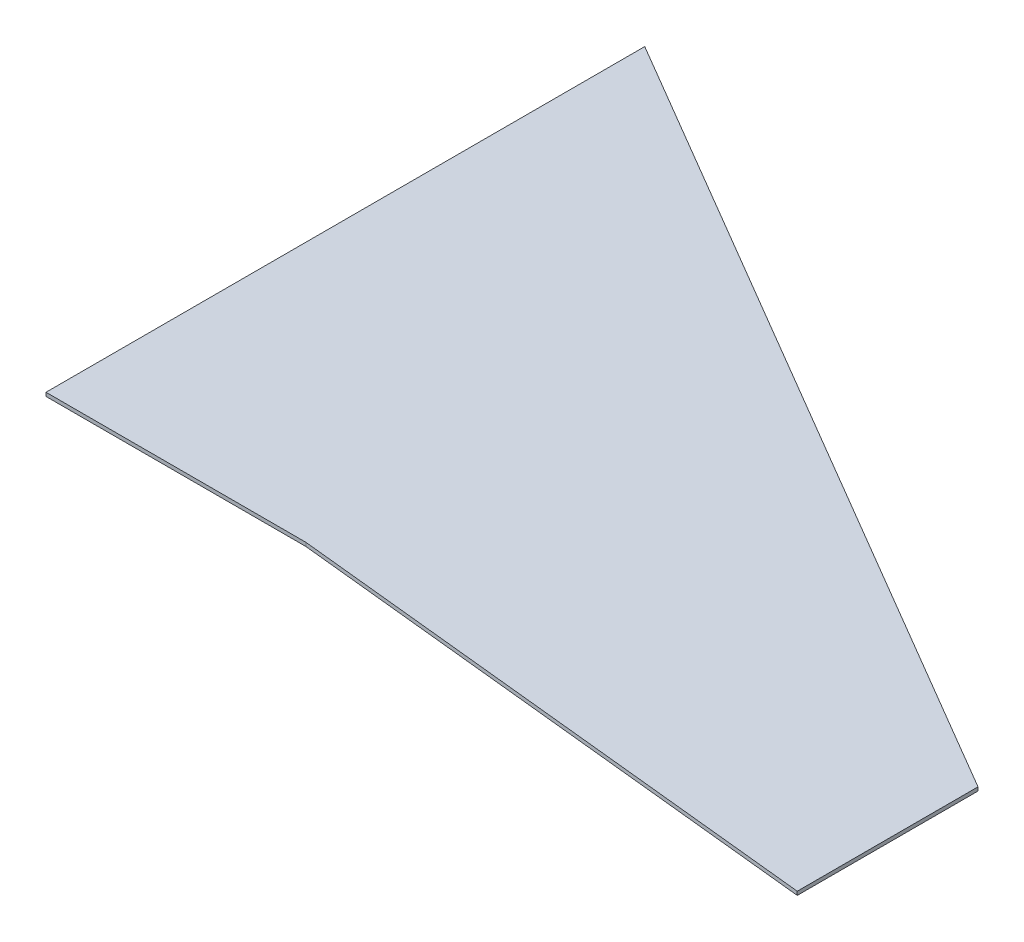
ISO-10303-21;
HEADER;
FILE_DESCRIPTION(('STEP AP214'),'2;1');
FILE_NAME('part.step','',(''),(''),'','','');
FILE_SCHEMA(('AUTOMOTIVE_DESIGN { 1 0 10303 214 1 1 1 1 }'));
ENDSEC;
DATA;
#1=APPLICATION_CONTEXT('core data for automotive mechanical design processes');
#2=APPLICATION_PROTOCOL_DEFINITION('international standard','automotive_design',2000,#1);
#3=PRODUCT_CONTEXT('',#1,'mechanical');
#4=PRODUCT('Part','Part','',(#3));
#5=PRODUCT_RELATED_PRODUCT_CATEGORY('part','',(#4));
#6=PRODUCT_DEFINITION_FORMATION('','',#4);
#7=PRODUCT_DEFINITION_CONTEXT('part definition',#1,'design');
#8=PRODUCT_DEFINITION('design','',#6,#7);
#9=PRODUCT_DEFINITION_SHAPE('','',#8);
#10=(LENGTH_UNIT() NAMED_UNIT(*) SI_UNIT(.MILLI.,.METRE.));
#11=(NAMED_UNIT(*) PLANE_ANGLE_UNIT() SI_UNIT($,.RADIAN.));
#12=(NAMED_UNIT(*) SI_UNIT($,.STERADIAN.) SOLID_ANGLE_UNIT());
#13=UNCERTAINTY_MEASURE_WITH_UNIT(LENGTH_MEASURE(1.E-05),#10,'distance_accuracy_value','');
#14=(GEOMETRIC_REPRESENTATION_CONTEXT(3) GLOBAL_UNCERTAINTY_ASSIGNED_CONTEXT((#13)) GLOBAL_UNIT_ASSIGNED_CONTEXT((#10,
#11,#12)) REPRESENTATION_CONTEXT('',''));
#15=CARTESIAN_POINT('',(0.,0.,0.));
#16=DIRECTION('',(0.,0.,1.));
#17=DIRECTION('',(1.,0.,0.));
#18=AXIS2_PLACEMENT_3D('',#15,#16,#17);
#19=CARTESIAN_POINT('',(146.05,2.0574,0.));
#20=DIRECTION('',(0.,0.,-1.));
#21=DIRECTION('',(-1.,0.,0.));
#22=AXIS2_PLACEMENT_3D('',#19,#20,#21);
#23=PLANE('',#22);
#24=DIRECTION('',(1.,0.,0.));
#25=VECTOR('',#24,1.);
#26=CARTESIAN_POINT('',(146.05,0.,0.));
#27=LINE('',#26,#25);
#28=CARTESIAN_POINT('',(0.,0.,0.));
#29=VERTEX_POINT('',#28);
#30=CARTESIAN_POINT('',(146.05,0.,0.));
#31=VERTEX_POINT('',#30);
#32=EDGE_CURVE('E111',#29,#31,#27,.T.);
#33=ORIENTED_EDGE('',*,*,#32,.T.);
#34=DIRECTION('',(0.,-1.,0.));
#35=VECTOR('',#34,1.);
#36=CARTESIAN_POINT('',(146.05,2.0574,0.));
#37=LINE('',#36,#35);
#38=CARTESIAN_POINT('',(146.05,2.0574,0.));
#39=VERTEX_POINT('',#38);
#40=EDGE_CURVE('E11',#39,#31,#37,.T.);
#41=ORIENTED_EDGE('',*,*,#40,.F.);
#42=DIRECTION('',(1.,0.,0.));
#43=VECTOR('',#42,1.);
#44=CARTESIAN_POINT('',(146.05,2.0574,0.));
#45=LINE('',#44,#43);
#46=CARTESIAN_POINT('',(0.,2.0574,0.));
#47=VERTEX_POINT('',#46);
#48=EDGE_CURVE('E119',#47,#39,#45,.T.);
#49=ORIENTED_EDGE('',*,*,#48,.F.);
#50=DIRECTION('',(0.,-1.,0.));
#51=VECTOR('',#50,1.);
#52=CARTESIAN_POINT('',(0.,2.0574,0.));
#53=LINE('',#52,#51);
#54=EDGE_CURVE('E107',#47,#29,#53,.T.);
#55=ORIENTED_EDGE('',*,*,#54,.T.);
#56=EDGE_LOOP('',(#33,#41,#49,#55));
#57=FACE_BOUND('',#56,.T.);
#58=ADVANCED_FACE('F37',(#57),#23,.F.);
#59=CARTESIAN_POINT('',(454.025,2.0574,31.75));
#60=DIRECTION('',(0.102549270737555,0.,-0.994727926154281));
#61=DIRECTION('',(-0.994727926154281,0.,-0.102549270737555));
#62=AXIS2_PLACEMENT_3D('',#59,#60,#61);
#63=PLANE('',#62);
#64=DIRECTION('',(0.994727926154281,0.,0.102549270737555));
#65=VECTOR('',#64,1.);
#66=CARTESIAN_POINT('',(454.025,0.,31.75));
#67=LINE('',#66,#65);
#68=CARTESIAN_POINT('',(454.025,0.,31.75));
#69=VERTEX_POINT('',#68);
#70=EDGE_CURVE('E114',#31,#69,#67,.T.);
#71=ORIENTED_EDGE('',*,*,#70,.T.);
#72=DIRECTION('',(0.,-1.,0.));
#73=VECTOR('',#72,1.);
#74=CARTESIAN_POINT('',(454.025,2.0574,31.75));
#75=LINE('',#74,#73);
#76=CARTESIAN_POINT('',(454.025,2.0574,31.75));
#77=VERTEX_POINT('',#76);
#78=EDGE_CURVE('E45',#77,#69,#75,.T.);
#79=ORIENTED_EDGE('',*,*,#78,.F.);
#80=DIRECTION('',(0.994727926154281,0.,0.102549270737555));
#81=VECTOR('',#80,1.);
#82=CARTESIAN_POINT('',(454.025,2.0574,31.75));
#83=LINE('',#82,#81);
#84=EDGE_CURVE('E87',#39,#77,#83,.T.);
#85=ORIENTED_EDGE('',*,*,#84,.F.);
#86=ORIENTED_EDGE('',*,*,#40,.T.);
#87=EDGE_LOOP('',(#71,#79,#85,#86));
#88=FACE_BOUND('',#87,.T.);
#89=ADVANCED_FACE('F138',(#88),#63,.F.);
#90=CARTESIAN_POINT('',(454.025,2.0574,-69.85));
#91=DIRECTION('',(-1.,0.,0.));
#92=DIRECTION('',(0.,0.,1.));
#93=AXIS2_PLACEMENT_3D('',#90,#91,#92);
#94=PLANE('',#93);
#95=DIRECTION('',(0.,0.,-1.));
#96=VECTOR('',#95,1.);
#97=CARTESIAN_POINT('',(454.025,0.,-69.85));
#98=LINE('',#97,#96);
#99=CARTESIAN_POINT('',(454.025,0.,-69.85));
#100=VERTEX_POINT('',#99);
#101=EDGE_CURVE('E102',#69,#100,#98,.T.);
#102=ORIENTED_EDGE('',*,*,#101,.T.);
#103=DIRECTION('',(0.,-1.,0.));
#104=VECTOR('',#103,1.);
#105=CARTESIAN_POINT('',(454.025,2.0574,-69.85));
#106=LINE('',#105,#104);
#107=CARTESIAN_POINT('',(454.025,2.0574,-69.85));
#108=VERTEX_POINT('',#107);
#109=EDGE_CURVE('E99',#108,#100,#106,.T.);
#110=ORIENTED_EDGE('',*,*,#109,.F.);
#111=DIRECTION('',(0.,0.,-1.));
#112=VECTOR('',#111,1.);
#113=CARTESIAN_POINT('',(454.025,2.0574,-69.85));
#114=LINE('',#113,#112);
#115=EDGE_CURVE('E91',#77,#108,#114,.T.);
#116=ORIENTED_EDGE('',*,*,#115,.F.);
#117=ORIENTED_EDGE('',*,*,#78,.T.);
#118=EDGE_LOOP('',(#102,#110,#116,#117));
#119=FACE_BOUND('',#118,.T.);
#120=ADVANCED_FACE('F100',(#119),#94,.F.);
#121=CARTESIAN_POINT('',(0.,2.0574,-336.55));
#122=DIRECTION('',(-0.506493016163748,0.,0.862244063231142));
#123=DIRECTION('',(0.862244063231142,0.,0.506493016163748));
#124=AXIS2_PLACEMENT_3D('',#121,#122,#123);
#125=PLANE('',#124);
#126=DIRECTION('',(-0.862244063231142,0.,-0.506493016163748));
#127=VECTOR('',#126,1.);
#128=CARTESIAN_POINT('',(0.,0.,-336.55));
#129=LINE('',#128,#127);
#130=CARTESIAN_POINT('',(0.,0.,-336.55));
#131=VERTEX_POINT('',#130);
#132=EDGE_CURVE('E73',#100,#131,#129,.T.);
#133=ORIENTED_EDGE('',*,*,#132,.T.);
#134=DIRECTION('',(0.,-1.,0.));
#135=VECTOR('',#134,1.);
#136=CARTESIAN_POINT('',(0.,2.0574,-336.55));
#137=LINE('',#136,#135);
#138=CARTESIAN_POINT('',(0.,2.0574,-336.55));
#139=VERTEX_POINT('',#138);
#140=EDGE_CURVE('E103',#139,#131,#137,.T.);
#141=ORIENTED_EDGE('',*,*,#140,.F.);
#142=DIRECTION('',(-0.862244063231142,0.,-0.506493016163748));
#143=VECTOR('',#142,1.);
#144=CARTESIAN_POINT('',(0.,2.0574,-336.55));
#145=LINE('',#144,#143);
#146=EDGE_CURVE('E95',#108,#139,#145,.T.);
#147=ORIENTED_EDGE('',*,*,#146,.F.);
#148=ORIENTED_EDGE('',*,*,#109,.T.);
#149=EDGE_LOOP('',(#133,#141,#147,#148));
#150=FACE_BOUND('',#149,.T.);
#151=ADVANCED_FACE('F105',(#150),#125,.F.);
#152=CARTESIAN_POINT('',(0.,2.0574,0.));
#153=DIRECTION('',(1.,0.,0.));
#154=DIRECTION('',(0.,0.,-1.));
#155=AXIS2_PLACEMENT_3D('',#152,#153,#154);
#156=PLANE('',#155);
#157=DIRECTION('',(0.,0.,1.));
#158=VECTOR('',#157,1.);
#159=CARTESIAN_POINT('',(0.,0.,0.));
#160=LINE('',#159,#158);
#161=EDGE_CURVE('E79',#131,#29,#160,.T.);
#162=ORIENTED_EDGE('',*,*,#161,.T.);
#163=ORIENTED_EDGE('',*,*,#54,.F.);
#164=DIRECTION('',(0.,0.,1.));
#165=VECTOR('',#164,1.);
#166=CARTESIAN_POINT('',(0.,2.0574,0.));
#167=LINE('',#166,#165);
#168=EDGE_CURVE('E53',#139,#47,#167,.T.);
#169=ORIENTED_EDGE('',*,*,#168,.F.);
#170=ORIENTED_EDGE('',*,*,#140,.T.);
#171=EDGE_LOOP('',(#162,#163,#169,#170));
#172=FACE_BOUND('',#171,.T.);
#173=ADVANCED_FACE('F127',(#172),#156,.F.);
#174=CARTESIAN_POINT('',(0.,2.0574,0.));
#175=DIRECTION('',(0.,-1.,0.));
#176=DIRECTION('',(0.,0.,-1.));
#177=AXIS2_PLACEMENT_3D('',#174,#175,#176);
#178=PLANE('',#177);
#179=ORIENTED_EDGE('',*,*,#48,.T.);
#180=ORIENTED_EDGE('',*,*,#84,.T.);
#181=ORIENTED_EDGE('',*,*,#115,.T.);
#182=ORIENTED_EDGE('',*,*,#146,.T.);
#183=ORIENTED_EDGE('',*,*,#168,.T.);
#184=EDGE_LOOP('',(#179,#180,#181,#182,#183));
#185=FACE_BOUND('',#184,.T.);
#186=ADVANCED_FACE('F93',(#185),#178,.F.);
#187=CARTESIAN_POINT('',(0.,0.,0.));
#188=DIRECTION('',(0.,-1.,0.));
#189=DIRECTION('',(0.,0.,-1.));
#190=AXIS2_PLACEMENT_3D('',#187,#188,#189);
#191=PLANE('',#190);
#192=ORIENTED_EDGE('',*,*,#32,.F.);
#193=ORIENTED_EDGE('',*,*,#161,.F.);
#194=ORIENTED_EDGE('',*,*,#132,.F.);
#195=ORIENTED_EDGE('',*,*,#101,.F.);
#196=ORIENTED_EDGE('',*,*,#70,.F.);
#197=EDGE_LOOP('',(#192,#193,#194,#195,#196));
#198=FACE_BOUND('',#197,.T.);
#199=ADVANCED_FACE('F123',(#198),#191,.T.);
#200=CLOSED_SHELL('',(#58,#89,#120,#151,#173,#186,#199));
#201=MANIFOLD_SOLID_BREP('B2',#200);
#202=ADVANCED_BREP_SHAPE_REPRESENTATION('',(#18,#201),#14);
#203=SHAPE_DEFINITION_REPRESENTATION(#9,#202);
ENDSEC;
END-ISO-10303-21;
